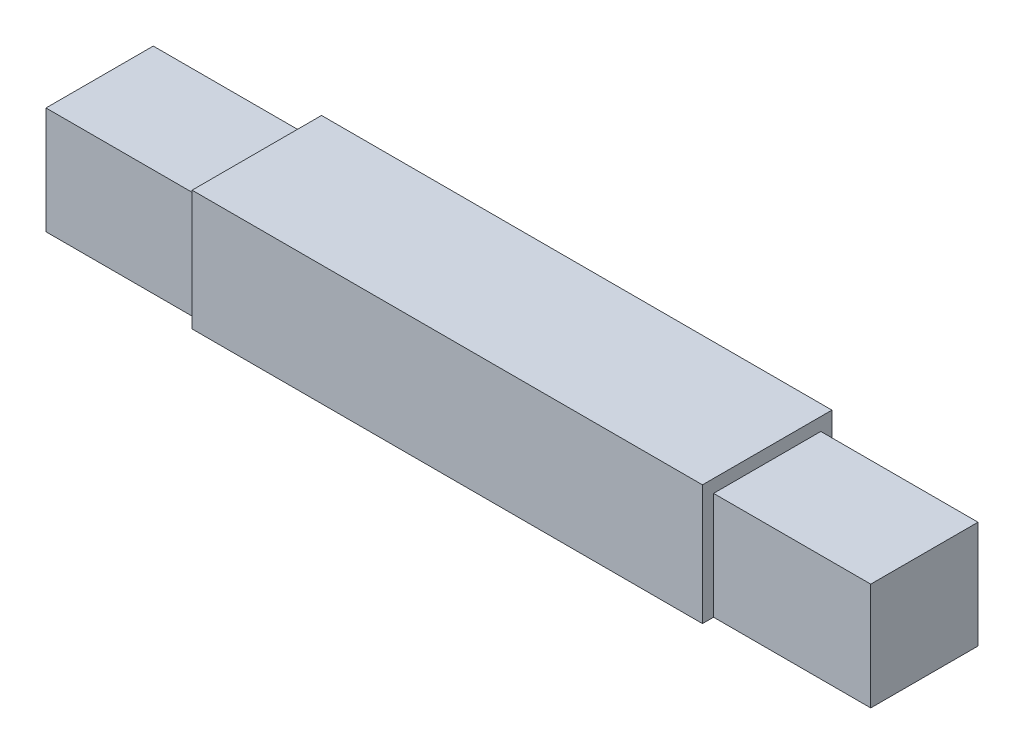
ISO-10303-21;
HEADER;
FILE_DESCRIPTION(('STEP AP214'),'2;1');
FILE_NAME('part.step','',(''),(''),'','','');
FILE_SCHEMA(('AUTOMOTIVE_DESIGN { 1 0 10303 214 1 1 1 1 }'));
ENDSEC;
DATA;
#1=APPLICATION_CONTEXT('core data for automotive mechanical design processes');
#2=APPLICATION_PROTOCOL_DEFINITION('international standard','automotive_design',2000,#1);
#3=PRODUCT_CONTEXT('',#1,'mechanical');
#4=PRODUCT('Part','Part','',(#3));
#5=PRODUCT_RELATED_PRODUCT_CATEGORY('part','',(#4));
#6=PRODUCT_DEFINITION_FORMATION('','',#4);
#7=PRODUCT_DEFINITION_CONTEXT('part definition',#1,'design');
#8=PRODUCT_DEFINITION('design','',#6,#7);
#9=PRODUCT_DEFINITION_SHAPE('','',#8);
#10=(LENGTH_UNIT() NAMED_UNIT(*) SI_UNIT(.MILLI.,.METRE.));
#11=(NAMED_UNIT(*) PLANE_ANGLE_UNIT() SI_UNIT($,.RADIAN.));
#12=(NAMED_UNIT(*) SI_UNIT($,.STERADIAN.) SOLID_ANGLE_UNIT());
#13=UNCERTAINTY_MEASURE_WITH_UNIT(LENGTH_MEASURE(1.E-05),#10,'distance_accuracy_value','');
#14=(GEOMETRIC_REPRESENTATION_CONTEXT(3) GLOBAL_UNCERTAINTY_ASSIGNED_CONTEXT((#13)) GLOBAL_UNIT_ASSIGNED_CONTEXT((#10,
#11,#12)) REPRESENTATION_CONTEXT('',''));
#15=CARTESIAN_POINT('',(0.,0.,0.));
#16=DIRECTION('',(0.,0.,1.));
#17=DIRECTION('',(1.,0.,0.));
#18=AXIS2_PLACEMENT_3D('',#15,#16,#17);
#19=CARTESIAN_POINT('',(17.526,8.255,0.));
#20=DIRECTION('',(-1.,0.,0.));
#21=DIRECTION('',(0.,0.,1.));
#22=AXIS2_PLACEMENT_3D('',#19,#20,#21);
#23=PLANE('',#22);
#24=DIRECTION('',(0.,-1.,0.));
#25=VECTOR('',#24,1.);
#26=CARTESIAN_POINT('',(17.526,7.366,3.683));
#27=LINE('',#26,#25);
#28=CARTESIAN_POINT('',(17.526,7.366,3.683));
#29=VERTEX_POINT('',#28);
#30=CARTESIAN_POINT('',(17.526,0.,3.683));
#31=VERTEX_POINT('',#30);
#32=EDGE_CURVE('E135',#29,#31,#27,.T.);
#33=ORIENTED_EDGE('',*,*,#32,.F.);
#34=DIRECTION('',(0.,0.,-1.));
#35=VECTOR('',#34,1.);
#36=CARTESIAN_POINT('',(17.526,7.366,0.));
#37=LINE('',#36,#35);
#38=CARTESIAN_POINT('',(17.526,7.366,-3.683));
#39=VERTEX_POINT('',#38);
#40=EDGE_CURVE('E142',#29,#39,#37,.T.);
#41=ORIENTED_EDGE('',*,*,#40,.T.);
#42=DIRECTION('',(0.,-1.,0.));
#43=VECTOR('',#42,1.);
#44=CARTESIAN_POINT('',(17.526,7.366,-3.683));
#45=LINE('',#44,#43);
#46=CARTESIAN_POINT('',(17.526,0.,-3.683));
#47=VERTEX_POINT('',#46);
#48=EDGE_CURVE('E229',#39,#47,#45,.T.);
#49=ORIENTED_EDGE('',*,*,#48,.T.);
#50=DIRECTION('',(0.,0.,-1.));
#51=VECTOR('',#50,1.);
#52=CARTESIAN_POINT('',(17.526,0.,0.));
#53=LINE('',#52,#51);
#54=CARTESIAN_POINT('',(17.526,0.,-4.445));
#55=VERTEX_POINT('',#54);
#56=EDGE_CURVE('E178',#47,#55,#53,.T.);
#57=ORIENTED_EDGE('',*,*,#56,.T.);
#58=DIRECTION('',(0.,-1.,0.));
#59=VECTOR('',#58,1.);
#60=CARTESIAN_POINT('',(17.526,8.255,-4.445));
#61=LINE('',#60,#59);
#62=CARTESIAN_POINT('',(17.526,8.255,-4.445));
#63=VERTEX_POINT('',#62);
#64=EDGE_CURVE('E184',#63,#55,#61,.T.);
#65=ORIENTED_EDGE('',*,*,#64,.F.);
#66=DIRECTION('',(0.,0.,-1.));
#67=VECTOR('',#66,1.);
#68=CARTESIAN_POINT('',(17.526,8.255,0.));
#69=LINE('',#68,#67);
#70=CARTESIAN_POINT('',(17.526,8.255,4.445));
#71=VERTEX_POINT('',#70);
#72=EDGE_CURVE('E169',#71,#63,#69,.T.);
#73=ORIENTED_EDGE('',*,*,#72,.F.);
#74=DIRECTION('',(0.,-1.,0.));
#75=VECTOR('',#74,1.);
#76=CARTESIAN_POINT('',(17.526,8.255,4.445));
#77=LINE('',#76,#75);
#78=CARTESIAN_POINT('',(17.526,0.,4.445));
#79=VERTEX_POINT('',#78);
#80=EDGE_CURVE('E187',#71,#79,#77,.T.);
#81=ORIENTED_EDGE('',*,*,#80,.T.);
#82=EDGE_CURVE('E154',#79,#31,#53,.T.);
#83=ORIENTED_EDGE('',*,*,#82,.T.);
#84=EDGE_LOOP('',(#33,#41,#49,#57,#65,#73,#81,#83));
#85=FACE_BOUND('',#84,.T.);
#86=ADVANCED_FACE('F36',(#85),#23,.F.);
#87=CARTESIAN_POINT('',(0.,7.366,3.683));
#88=DIRECTION('',(0.,0.,-1.));
#89=DIRECTION('',(-1.,0.,0.));
#90=AXIS2_PLACEMENT_3D('',#87,#88,#89);
#91=PLANE('',#90);
#92=DIRECTION('',(1.,0.,0.));
#93=VECTOR('',#92,1.);
#94=CARTESIAN_POINT('',(0.,0.,3.683));
#95=LINE('',#94,#93);
#96=CARTESIAN_POINT('',(-28.321,0.,3.683));
#97=VERTEX_POINT('',#96);
#98=CARTESIAN_POINT('',(-17.526,0.,3.683));
#99=VERTEX_POINT('',#98);
#100=EDGE_CURVE('E191',#97,#99,#95,.T.);
#101=ORIENTED_EDGE('',*,*,#100,.T.);
#102=DIRECTION('',(0.,-1.,0.));
#103=VECTOR('',#102,1.);
#104=CARTESIAN_POINT('',(-17.526,7.366,3.683));
#105=LINE('',#104,#103);
#106=CARTESIAN_POINT('',(-17.526,7.366,3.683));
#107=VERTEX_POINT('',#106);
#108=EDGE_CURVE('E11',#107,#99,#105,.T.);
#109=ORIENTED_EDGE('',*,*,#108,.F.);
#110=DIRECTION('',(1.,0.,0.));
#111=VECTOR('',#110,1.);
#112=CARTESIAN_POINT('',(0.,7.366,3.683));
#113=LINE('',#112,#111);
#114=CARTESIAN_POINT('',(-28.321,7.366,3.683));
#115=VERTEX_POINT('',#114);
#116=EDGE_CURVE('E83',#115,#107,#113,.T.);
#117=ORIENTED_EDGE('',*,*,#116,.F.);
#118=DIRECTION('',(0.,-1.,0.));
#119=VECTOR('',#118,1.);
#120=CARTESIAN_POINT('',(-28.321,7.366,3.683));
#121=LINE('',#120,#119);
#122=EDGE_CURVE('E60',#115,#97,#121,.T.);
#123=ORIENTED_EDGE('',*,*,#122,.T.);
#124=EDGE_LOOP('',(#101,#109,#117,#123));
#125=FACE_BOUND('',#124,.T.);
#126=ADVANCED_FACE('F38',(#125),#91,.F.);
#127=CARTESIAN_POINT('',(0.,7.366,-3.683));
#128=DIRECTION('',(0.,0.,-1.));
#129=DIRECTION('',(-1.,0.,0.));
#130=AXIS2_PLACEMENT_3D('',#127,#128,#129);
#131=PLANE('',#130);
#132=DIRECTION('',(1.,0.,0.));
#133=VECTOR('',#132,1.);
#134=CARTESIAN_POINT('',(0.,0.,-3.683));
#135=LINE('',#134,#133);
#136=CARTESIAN_POINT('',(-28.321,0.,-3.683));
#137=VERTEX_POINT('',#136);
#138=CARTESIAN_POINT('',(-17.526,0.,-3.683));
#139=VERTEX_POINT('',#138);
#140=EDGE_CURVE('E202',#137,#139,#135,.T.);
#141=ORIENTED_EDGE('',*,*,#140,.F.);
#142=DIRECTION('',(0.,-1.,0.));
#143=VECTOR('',#142,1.);
#144=CARTESIAN_POINT('',(-28.321,7.366,-3.683));
#145=LINE('',#144,#143);
#146=CARTESIAN_POINT('',(-28.321,7.366,-3.683));
#147=VERTEX_POINT('',#146);
#148=EDGE_CURVE('E208',#147,#137,#145,.T.);
#149=ORIENTED_EDGE('',*,*,#148,.F.);
#150=DIRECTION('',(1.,0.,0.));
#151=VECTOR('',#150,1.);
#152=CARTESIAN_POINT('',(0.,7.366,-3.683));
#153=LINE('',#152,#151);
#154=CARTESIAN_POINT('',(-17.526,7.366,-3.683));
#155=VERTEX_POINT('',#154);
#156=EDGE_CURVE('E196',#147,#155,#153,.T.);
#157=ORIENTED_EDGE('',*,*,#156,.T.);
#158=DIRECTION('',(0.,-1.,0.));
#159=VECTOR('',#158,1.);
#160=CARTESIAN_POINT('',(-17.526,7.366,-3.683));
#161=LINE('',#160,#159);
#162=EDGE_CURVE('E44',#155,#139,#161,.T.);
#163=ORIENTED_EDGE('',*,*,#162,.T.);
#164=EDGE_LOOP('',(#141,#149,#157,#163));
#165=FACE_BOUND('',#164,.T.);
#166=ADVANCED_FACE('F212',(#165),#131,.T.);
#167=CARTESIAN_POINT('',(-28.321,7.366,0.));
#168=DIRECTION('',(-1.,0.,0.));
#169=DIRECTION('',(0.,0.,1.));
#170=AXIS2_PLACEMENT_3D('',#167,#168,#169);
#171=PLANE('',#170);
#172=DIRECTION('',(0.,0.,-1.));
#173=VECTOR('',#172,1.);
#174=CARTESIAN_POINT('',(-28.321,0.,0.));
#175=LINE('',#174,#173);
#176=EDGE_CURVE('E194',#97,#137,#175,.T.);
#177=ORIENTED_EDGE('',*,*,#176,.F.);
#178=ORIENTED_EDGE('',*,*,#122,.F.);
#179=DIRECTION('',(0.,0.,-1.));
#180=VECTOR('',#179,1.);
#181=CARTESIAN_POINT('',(-28.321,7.366,0.));
#182=LINE('',#181,#180);
#183=EDGE_CURVE('E199',#115,#147,#182,.T.);
#184=ORIENTED_EDGE('',*,*,#183,.T.);
#185=ORIENTED_EDGE('',*,*,#148,.T.);
#186=EDGE_LOOP('',(#177,#178,#184,#185));
#187=FACE_BOUND('',#186,.T.);
#188=ADVANCED_FACE('F268',(#187),#171,.T.);
#189=CARTESIAN_POINT('',(0.,7.366,0.));
#190=DIRECTION('',(0.,1.,0.));
#191=DIRECTION('',(0.,0.,1.));
#192=AXIS2_PLACEMENT_3D('',#189,#190,#191);
#193=PLANE('',#192);
#194=ORIENTED_EDGE('',*,*,#116,.T.);
#195=DIRECTION('',(0.,0.,-1.));
#196=VECTOR('',#195,1.);
#197=CARTESIAN_POINT('',(-17.526,7.366,0.));
#198=LINE('',#197,#196);
#199=EDGE_CURVE('E193',#107,#155,#198,.T.);
#200=ORIENTED_EDGE('',*,*,#199,.T.);
#201=ORIENTED_EDGE('',*,*,#156,.F.);
#202=ORIENTED_EDGE('',*,*,#183,.F.);
#203=EDGE_LOOP('',(#194,#200,#201,#202));
#204=FACE_BOUND('',#203,.T.);
#205=ADVANCED_FACE('F265',(#204),#193,.T.);
#206=CARTESIAN_POINT('',(0.,0.,0.));
#207=DIRECTION('',(0.,1.,0.));
#208=DIRECTION('',(0.,0.,1.));
#209=AXIS2_PLACEMENT_3D('',#206,#207,#208);
#210=PLANE('',#209);
#211=ORIENTED_EDGE('',*,*,#100,.F.);
#212=ORIENTED_EDGE('',*,*,#176,.T.);
#213=ORIENTED_EDGE('',*,*,#140,.T.);
#214=DIRECTION('',(0.,0.,-1.));
#215=VECTOR('',#214,1.);
#216=CARTESIAN_POINT('',(-17.526,0.,0.));
#217=LINE('',#216,#215);
#218=CARTESIAN_POINT('',(-17.526,0.,-4.445));
#219=VERTEX_POINT('',#218);
#220=EDGE_CURVE('E155',#139,#219,#217,.T.);
#221=ORIENTED_EDGE('',*,*,#220,.T.);
#222=DIRECTION('',(1.,0.,0.));
#223=VECTOR('',#222,1.);
#224=CARTESIAN_POINT('',(0.,0.,-4.445));
#225=LINE('',#224,#223);
#226=EDGE_CURVE('E167',#219,#55,#225,.T.);
#227=ORIENTED_EDGE('',*,*,#226,.T.);
#228=ORIENTED_EDGE('',*,*,#56,.F.);
#229=DIRECTION('',(1.,0.,0.));
#230=VECTOR('',#229,1.);
#231=CARTESIAN_POINT('',(0.,0.,-3.683));
#232=LINE('',#231,#230);
#233=CARTESIAN_POINT('',(28.321,0.,-3.683));
#234=VERTEX_POINT('',#233);
#235=EDGE_CURVE('E51',#47,#234,#232,.T.);
#236=ORIENTED_EDGE('',*,*,#235,.T.);
#237=DIRECTION('',(0.,0.,-1.));
#238=VECTOR('',#237,1.);
#239=CARTESIAN_POINT('',(28.321,0.,0.));
#240=LINE('',#239,#238);
#241=CARTESIAN_POINT('',(28.321,0.,3.683));
#242=VERTEX_POINT('',#241);
#243=EDGE_CURVE('E234',#242,#234,#240,.T.);
#244=ORIENTED_EDGE('',*,*,#243,.F.);
#245=DIRECTION('',(1.,0.,0.));
#246=VECTOR('',#245,1.);
#247=CARTESIAN_POINT('',(0.,0.,3.683));
#248=LINE('',#247,#246);
#249=EDGE_CURVE('E237',#31,#242,#248,.T.);
#250=ORIENTED_EDGE('',*,*,#249,.F.);
#251=ORIENTED_EDGE('',*,*,#82,.F.);
#252=DIRECTION('',(1.,0.,0.));
#253=VECTOR('',#252,1.);
#254=CARTESIAN_POINT('',(0.,0.,4.445));
#255=LINE('',#254,#253);
#256=CARTESIAN_POINT('',(-17.526,0.,4.445));
#257=VERTEX_POINT('',#256);
#258=EDGE_CURVE('E176',#257,#79,#255,.T.);
#259=ORIENTED_EDGE('',*,*,#258,.F.);
#260=EDGE_CURVE('E157',#257,#99,#217,.T.);
#261=ORIENTED_EDGE('',*,*,#260,.T.);
#262=EDGE_LOOP('',(#211,#212,#213,#221,#227,#228,#236,#244,#250,#251,#259,#261));
#263=FACE_BOUND('',#262,.T.);
#264=ADVANCED_FACE('F218',(#263),#210,.F.);
#265=CARTESIAN_POINT('',(-17.526,8.255,0.));
#266=DIRECTION('',(-1.,0.,0.));
#267=DIRECTION('',(0.,0.,1.));
#268=AXIS2_PLACEMENT_3D('',#265,#266,#267);
#269=PLANE('',#268);
#270=ORIENTED_EDGE('',*,*,#162,.F.);
#271=ORIENTED_EDGE('',*,*,#199,.F.);
#272=ORIENTED_EDGE('',*,*,#108,.T.);
#273=ORIENTED_EDGE('',*,*,#260,.F.);
#274=DIRECTION('',(0.,-1.,0.));
#275=VECTOR('',#274,1.);
#276=CARTESIAN_POINT('',(-17.526,8.255,4.445));
#277=LINE('',#276,#275);
#278=CARTESIAN_POINT('',(-17.526,8.255,4.445));
#279=VERTEX_POINT('',#278);
#280=EDGE_CURVE('E189',#279,#257,#277,.T.);
#281=ORIENTED_EDGE('',*,*,#280,.F.);
#282=DIRECTION('',(0.,0.,-1.));
#283=VECTOR('',#282,1.);
#284=CARTESIAN_POINT('',(-17.526,8.255,0.));
#285=LINE('',#284,#283);
#286=CARTESIAN_POINT('',(-17.526,8.255,-4.445));
#287=VERTEX_POINT('',#286);
#288=EDGE_CURVE('E163',#279,#287,#285,.T.);
#289=ORIENTED_EDGE('',*,*,#288,.T.);
#290=DIRECTION('',(0.,-1.,0.));
#291=VECTOR('',#290,1.);
#292=CARTESIAN_POINT('',(-17.526,8.255,-4.445));
#293=LINE('',#292,#291);
#294=EDGE_CURVE('E173',#287,#219,#293,.T.);
#295=ORIENTED_EDGE('',*,*,#294,.T.);
#296=ORIENTED_EDGE('',*,*,#220,.F.);
#297=EDGE_LOOP('',(#270,#271,#272,#273,#281,#289,#295,#296));
#298=FACE_BOUND('',#297,.T.);
#299=ADVANCED_FACE('F219',(#298),#269,.T.);
#300=CARTESIAN_POINT('',(0.,8.255,4.445));
#301=DIRECTION('',(0.,0.,-1.));
#302=DIRECTION('',(-1.,0.,0.));
#303=AXIS2_PLACEMENT_3D('',#300,#301,#302);
#304=PLANE('',#303);
#305=ORIENTED_EDGE('',*,*,#258,.T.);
#306=ORIENTED_EDGE('',*,*,#80,.F.);
#307=DIRECTION('',(1.,0.,0.));
#308=VECTOR('',#307,1.);
#309=CARTESIAN_POINT('',(0.,8.255,4.445));
#310=LINE('',#309,#308);
#311=EDGE_CURVE('E166',#279,#71,#310,.T.);
#312=ORIENTED_EDGE('',*,*,#311,.F.);
#313=ORIENTED_EDGE('',*,*,#280,.T.);
#314=EDGE_LOOP('',(#305,#306,#312,#313));
#315=FACE_BOUND('',#314,.T.);
#316=ADVANCED_FACE('F259',(#315),#304,.F.);
#317=CARTESIAN_POINT('',(0.,8.255,-4.445));
#318=DIRECTION('',(0.,0.,-1.));
#319=DIRECTION('',(-1.,0.,0.));
#320=AXIS2_PLACEMENT_3D('',#317,#318,#319);
#321=PLANE('',#320);
#322=ORIENTED_EDGE('',*,*,#226,.F.);
#323=ORIENTED_EDGE('',*,*,#294,.F.);
#324=DIRECTION('',(1.,0.,0.));
#325=VECTOR('',#324,1.);
#326=CARTESIAN_POINT('',(0.,8.255,-4.445));
#327=LINE('',#326,#325);
#328=EDGE_CURVE('E171',#287,#63,#327,.T.);
#329=ORIENTED_EDGE('',*,*,#328,.T.);
#330=ORIENTED_EDGE('',*,*,#64,.T.);
#331=EDGE_LOOP('',(#322,#323,#329,#330));
#332=FACE_BOUND('',#331,.T.);
#333=ADVANCED_FACE('F224',(#332),#321,.T.);
#334=CARTESIAN_POINT('',(0.,8.255,0.));
#335=DIRECTION('',(0.,1.,0.));
#336=DIRECTION('',(0.,0.,1.));
#337=AXIS2_PLACEMENT_3D('',#334,#335,#336);
#338=PLANE('',#337);
#339=ORIENTED_EDGE('',*,*,#288,.F.);
#340=ORIENTED_EDGE('',*,*,#311,.T.);
#341=ORIENTED_EDGE('',*,*,#72,.T.);
#342=ORIENTED_EDGE('',*,*,#328,.F.);
#343=EDGE_LOOP('',(#339,#340,#341,#342));
#344=FACE_BOUND('',#343,.T.);
#345=ADVANCED_FACE('F303',(#344),#338,.T.);
#346=CARTESIAN_POINT('',(0.,7.366,3.683));
#347=DIRECTION('',(0.,0.,-1.));
#348=DIRECTION('',(-1.,0.,0.));
#349=AXIS2_PLACEMENT_3D('',#346,#347,#348);
#350=PLANE('',#349);
#351=ORIENTED_EDGE('',*,*,#249,.T.);
#352=DIRECTION('',(0.,-1.,0.));
#353=VECTOR('',#352,1.);
#354=CARTESIAN_POINT('',(28.321,7.366,3.683));
#355=LINE('',#354,#353);
#356=CARTESIAN_POINT('',(28.321,7.366,3.683));
#357=VERTEX_POINT('',#356);
#358=EDGE_CURVE('E138',#357,#242,#355,.T.);
#359=ORIENTED_EDGE('',*,*,#358,.F.);
#360=DIRECTION('',(1.,0.,0.));
#361=VECTOR('',#360,1.);
#362=CARTESIAN_POINT('',(0.,7.366,3.683));
#363=LINE('',#362,#361);
#364=EDGE_CURVE('E131',#29,#357,#363,.T.);
#365=ORIENTED_EDGE('',*,*,#364,.F.);
#366=ORIENTED_EDGE('',*,*,#32,.T.);
#367=EDGE_LOOP('',(#351,#359,#365,#366));
#368=FACE_BOUND('',#367,.T.);
#369=ADVANCED_FACE('F133',(#368),#350,.F.);
#370=CARTESIAN_POINT('',(28.321,7.366,0.));
#371=DIRECTION('',(-1.,0.,0.));
#372=DIRECTION('',(0.,0.,1.));
#373=AXIS2_PLACEMENT_3D('',#370,#371,#372);
#374=PLANE('',#373);
#375=ORIENTED_EDGE('',*,*,#243,.T.);
#376=DIRECTION('',(0.,-1.,0.));
#377=VECTOR('',#376,1.);
#378=CARTESIAN_POINT('',(28.321,7.366,-3.683));
#379=LINE('',#378,#377);
#380=CARTESIAN_POINT('',(28.321,7.366,-3.683));
#381=VERTEX_POINT('',#380);
#382=EDGE_CURVE('E159',#381,#234,#379,.T.);
#383=ORIENTED_EDGE('',*,*,#382,.F.);
#384=DIRECTION('',(0.,0.,-1.));
#385=VECTOR('',#384,1.);
#386=CARTESIAN_POINT('',(28.321,7.366,0.));
#387=LINE('',#386,#385);
#388=EDGE_CURVE('E141',#357,#381,#387,.T.);
#389=ORIENTED_EDGE('',*,*,#388,.F.);
#390=ORIENTED_EDGE('',*,*,#358,.T.);
#391=EDGE_LOOP('',(#375,#383,#389,#390));
#392=FACE_BOUND('',#391,.T.);
#393=ADVANCED_FACE('F241',(#392),#374,.F.);
#394=CARTESIAN_POINT('',(0.,7.366,-3.683));
#395=DIRECTION('',(0.,0.,-1.));
#396=DIRECTION('',(-1.,0.,0.));
#397=AXIS2_PLACEMENT_3D('',#394,#395,#396);
#398=PLANE('',#397);
#399=ORIENTED_EDGE('',*,*,#235,.F.);
#400=ORIENTED_EDGE('',*,*,#48,.F.);
#401=DIRECTION('',(1.,0.,0.));
#402=VECTOR('',#401,1.);
#403=CARTESIAN_POINT('',(0.,7.366,-3.683));
#404=LINE('',#403,#402);
#405=EDGE_CURVE('E148',#39,#381,#404,.T.);
#406=ORIENTED_EDGE('',*,*,#405,.T.);
#407=ORIENTED_EDGE('',*,*,#382,.T.);
#408=EDGE_LOOP('',(#399,#400,#406,#407));
#409=FACE_BOUND('',#408,.T.);
#410=ADVANCED_FACE('F242',(#409),#398,.T.);
#411=CARTESIAN_POINT('',(0.,7.366,0.));
#412=DIRECTION('',(0.,1.,0.));
#413=DIRECTION('',(0.,0.,1.));
#414=AXIS2_PLACEMENT_3D('',#411,#412,#413);
#415=PLANE('',#414);
#416=ORIENTED_EDGE('',*,*,#40,.F.);
#417=ORIENTED_EDGE('',*,*,#364,.T.);
#418=ORIENTED_EDGE('',*,*,#388,.T.);
#419=ORIENTED_EDGE('',*,*,#405,.F.);
#420=EDGE_LOOP('',(#416,#417,#418,#419));
#421=FACE_BOUND('',#420,.T.);
#422=ADVANCED_FACE('F146',(#421),#415,.T.);
#423=CLOSED_SHELL('',(#86,#126,#166,#188,#205,#264,#299,#316,#333,#345,#369,#393,#410,#422));
#424=MANIFOLD_SOLID_BREP('B2',#423);
#425=ADVANCED_BREP_SHAPE_REPRESENTATION('',(#18,#424),#14);
#426=SHAPE_DEFINITION_REPRESENTATION(#9,#425);
ENDSEC;
END-ISO-10303-21;
